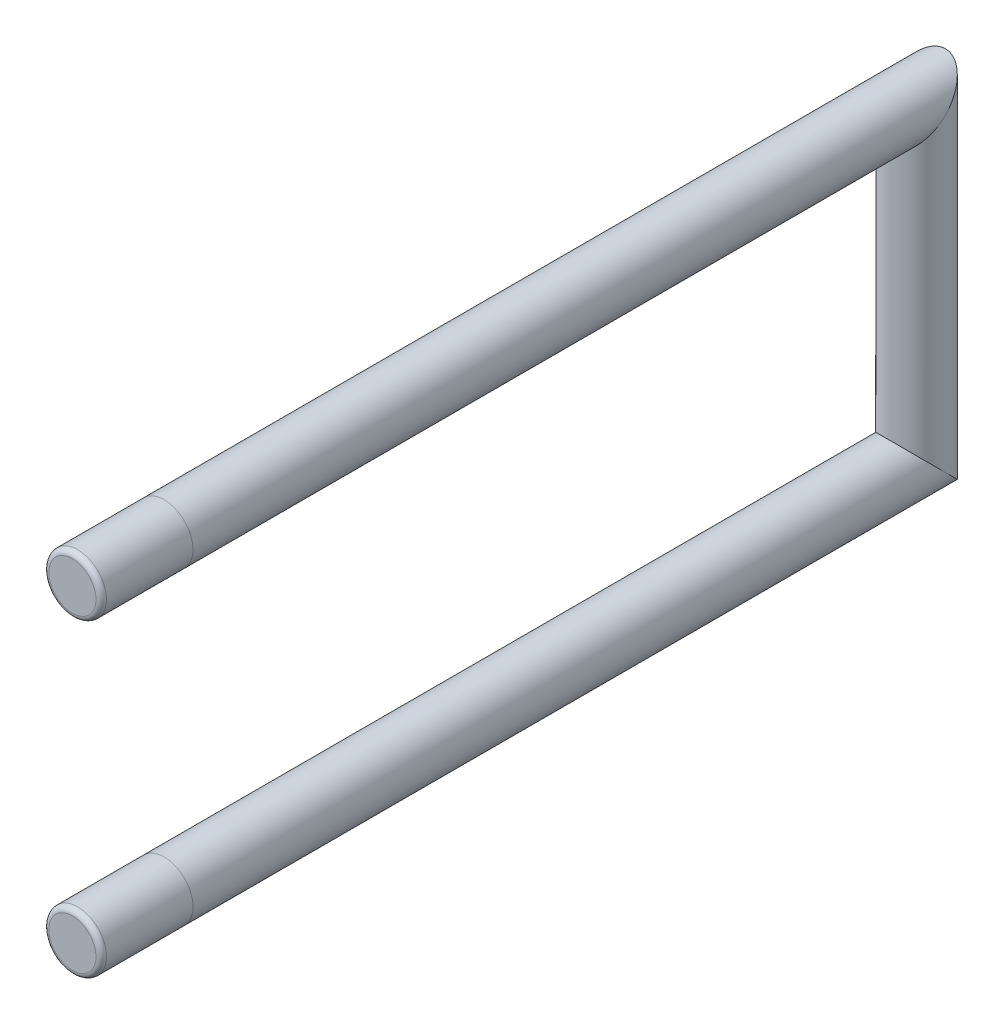
ISO-10303-21;
HEADER;
FILE_DESCRIPTION(('STEP AP214'),'2;1');
FILE_NAME('part.step','',(''),(''),'','','');
FILE_SCHEMA(('AUTOMOTIVE_DESIGN { 1 0 10303 214 1 1 1 1 }'));
ENDSEC;
DATA;
#1=APPLICATION_CONTEXT('core data for automotive mechanical design processes');
#2=APPLICATION_PROTOCOL_DEFINITION('international standard','automotive_design',2000,#1);
#3=PRODUCT_CONTEXT('',#1,'mechanical');
#4=PRODUCT('Part','Part','',(#3));
#5=PRODUCT_RELATED_PRODUCT_CATEGORY('part','',(#4));
#6=PRODUCT_DEFINITION_FORMATION('','',#4);
#7=PRODUCT_DEFINITION_CONTEXT('part definition',#1,'design');
#8=PRODUCT_DEFINITION('design','',#6,#7);
#9=PRODUCT_DEFINITION_SHAPE('','',#8);
#10=(LENGTH_UNIT() NAMED_UNIT(*) SI_UNIT(.MILLI.,.METRE.));
#11=(NAMED_UNIT(*) PLANE_ANGLE_UNIT() SI_UNIT($,.RADIAN.));
#12=(NAMED_UNIT(*) SI_UNIT($,.STERADIAN.) SOLID_ANGLE_UNIT());
#13=UNCERTAINTY_MEASURE_WITH_UNIT(LENGTH_MEASURE(1.E-05),#10,'distance_accuracy_value','');
#14=(GEOMETRIC_REPRESENTATION_CONTEXT(3) GLOBAL_UNCERTAINTY_ASSIGNED_CONTEXT((#13)) GLOBAL_UNIT_ASSIGNED_CONTEXT((#10,
#11,#12)) REPRESENTATION_CONTEXT('',''));
#15=CARTESIAN_POINT('',(0.,0.,0.));
#16=DIRECTION('',(0.,0.,1.));
#17=DIRECTION('',(1.,0.,0.));
#18=AXIS2_PLACEMENT_3D('',#15,#16,#17);
#19=CARTESIAN_POINT('',(0.,118.,0.));
#20=DIRECTION('',(0.,-1.,0.));
#21=DIRECTION('',(0.,0.,-1.));
#22=AXIS2_PLACEMENT_3D('',#19,#20,#21);
#23=CYLINDRICAL_SURFACE('',#22,11.);
#24=CARTESIAN_POINT('',(0.,0.,0.));
#25=DIRECTION('',(0.,0.707106781186547,-0.707106781186547));
#26=DIRECTION('',(0.,-0.707106781186547,-0.707106781186547));
#27=AXIS2_PLACEMENT_3D('',#24,#25,#26);
#28=ELLIPSE('',#27,15.556349186104,11.);
#29=CARTESIAN_POINT('',(-0.104879692967884,-10.9995000000001,-10.9995000000001));
#30=VERTEX_POINT('',#29);
#31=CARTESIAN_POINT('',(0.104879692967884,-10.9995000000001,-10.9995000000001));
#32=VERTEX_POINT('',#31);
#33=EDGE_CURVE('E60',#30,#32,#28,.T.);
#34=ORIENTED_EDGE('',*,*,#33,.T.);
#35=CARTESIAN_POINT('',(0.,-21.9990000000002,0.));
#36=DIRECTION('',(0.,-0.707106781186551,-0.707106781186544));
#37=DIRECTION('',(0.,-0.707106781186544,0.707106781186551));
#38=AXIS2_PLACEMENT_3D('',#35,#36,#37);
#39=ELLIPSE('',#38,15.556349186104,11.);
#40=EDGE_CURVE('E71',#32,#30,#39,.F.);
#41=ORIENTED_EDGE('',*,*,#40,.T.);
#42=EDGE_LOOP('',(#34,#41));
#43=FACE_BOUND('',#42,.T.);
#44=CARTESIAN_POINT('',(0.,118.,0.));
#45=DIRECTION('',(0.,-0.707106781186547,-0.707106781186547));
#46=DIRECTION('',(0.,-0.707106781186547,0.707106781186547));
#47=AXIS2_PLACEMENT_3D('',#44,#45,#46);
#48=ELLIPSE('',#47,15.556349186104,11.);
#49=CARTESIAN_POINT('',(-0.104879692967824,128.9995,-10.9995000000001));
#50=VERTEX_POINT('',#49);
#51=CARTESIAN_POINT('',(0.104879692967745,128.9995,-10.9995000000001));
#52=VERTEX_POINT('',#51);
#53=EDGE_CURVE('E48',#50,#52,#48,.F.);
#54=ORIENTED_EDGE('',*,*,#53,.F.);
#55=CARTESIAN_POINT('',(0.,139.999,0.));
#56=DIRECTION('',(0.,-0.707106781186551,0.707106781186544));
#57=DIRECTION('',(0.,-0.707106781186544,-0.707106781186551));
#58=AXIS2_PLACEMENT_3D('',#55,#56,#57);
#59=ELLIPSE('',#58,15.556349186104,11.);
#60=EDGE_CURVE('E72',#50,#52,#59,.T.);
#61=ORIENTED_EDGE('',*,*,#60,.T.);
#62=EDGE_LOOP('',(#54,#61));
#63=FACE_BOUND('',#62,.T.);
#64=ADVANCED_FACE('F34',(#43,#63),#23,.T.);
#65=CARTESIAN_POINT('',(0.,0.,287.));
#66=DIRECTION('',(0.,0.,-1.));
#67=DIRECTION('',(-1.,0.,0.));
#68=AXIS2_PLACEMENT_3D('',#65,#66,#67);
#69=CYLINDRICAL_SURFACE('',#68,11.);
#70=CARTESIAN_POINT('',(0.,0.,287.));
#71=DIRECTION('',(0.,0.,1.));
#72=DIRECTION('',(1.,0.,0.));
#73=AXIS2_PLACEMENT_3D('',#70,#71,#72);
#74=CIRCLE('',#73,10.9995);
#75=CARTESIAN_POINT('',(10.9995,0.,287.));
#76=VERTEX_POINT('',#75);
#77=EDGE_CURVE('E67',#76,#76,#74,.T.);
#78=ORIENTED_EDGE('',*,*,#77,.F.);
#79=EDGE_LOOP('',(#78));
#80=FACE_BOUND('',#79,.T.);
#81=ORIENTED_EDGE('',*,*,#33,.F.);
#82=CARTESIAN_POINT('',(0.,0.,-21.9990000000004));
#83=DIRECTION('',(0.,-0.707106781186551,-0.707106781186544));
#84=DIRECTION('',(0.,0.707106781186544,-0.707106781186551));
#85=AXIS2_PLACEMENT_3D('',#82,#83,#84);
#86=ELLIPSE('',#85,15.5563491861041,11.);
#87=EDGE_CURVE('E63',#30,#32,#86,.F.);
#88=ORIENTED_EDGE('',*,*,#87,.T.);
#89=EDGE_LOOP('',(#81,#88));
#90=FACE_BOUND('',#89,.T.);
#91=ADVANCED_FACE('F62',(#80,#90),#69,.T.);
#92=CARTESIAN_POINT('',(0.,118.,287.));
#93=DIRECTION('',(0.,0.,-1.));
#94=DIRECTION('',(-1.,0.,0.));
#95=AXIS2_PLACEMENT_3D('',#92,#93,#94);
#96=CYLINDRICAL_SURFACE('',#95,11.);
#97=CARTESIAN_POINT('',(0.,118.,287.));
#98=DIRECTION('',(0.,0.,1.));
#99=DIRECTION('',(1.,0.,0.));
#100=AXIS2_PLACEMENT_3D('',#97,#98,#99);
#101=CIRCLE('',#100,10.9995);
#102=CARTESIAN_POINT('',(10.9995,118.,287.));
#103=VERTEX_POINT('',#102);
#104=EDGE_CURVE('E86',#103,#103,#101,.T.);
#105=ORIENTED_EDGE('',*,*,#104,.F.);
#106=EDGE_LOOP('',(#105));
#107=FACE_BOUND('',#106,.T.);
#108=ORIENTED_EDGE('',*,*,#53,.T.);
#109=CARTESIAN_POINT('',(0.,118.,-21.9990000000004));
#110=DIRECTION('',(0.,-0.707106781186551,0.707106781186544));
#111=DIRECTION('',(0.,-0.707106781186544,-0.707106781186551));
#112=AXIS2_PLACEMENT_3D('',#109,#110,#111);
#113=ELLIPSE('',#112,15.5563491861041,11.);
#114=EDGE_CURVE('E79',#52,#50,#113,.T.);
#115=ORIENTED_EDGE('',*,*,#114,.T.);
#116=EDGE_LOOP('',(#108,#115));
#117=FACE_BOUND('',#116,.T.);
#118=ADVANCED_FACE('F93',(#107,#117),#96,.T.);
#119=CARTESIAN_POINT('',(0.,0.,-21.9990000000004));
#120=DIRECTION('',(0.,-0.707106781186551,-0.707106781186544));
#121=DIRECTION('',(0.,0.707106781186544,-0.707106781186551));
#122=AXIS2_PLACEMENT_3D('',#119,#120,#121);
#123=PLANE('',#122);
#124=ORIENTED_EDGE('',*,*,#40,.F.);
#125=ORIENTED_EDGE('',*,*,#87,.F.);
#126=EDGE_LOOP('',(#124,#125));
#127=FACE_BOUND('',#126,.T.);
#128=ADVANCED_FACE('F70',(#127),#123,.T.);
#129=CARTESIAN_POINT('',(0.,118.,-21.9990000000004));
#130=DIRECTION('',(0.,-0.707106781186551,0.707106781186544));
#131=DIRECTION('',(0.,-0.707106781186544,-0.707106781186551));
#132=AXIS2_PLACEMENT_3D('',#129,#130,#131);
#133=PLANE('',#132);
#134=ORIENTED_EDGE('',*,*,#60,.F.);
#135=ORIENTED_EDGE('',*,*,#114,.F.);
#136=EDGE_LOOP('',(#134,#135));
#137=FACE_BOUND('',#136,.T.);
#138=ADVANCED_FACE('F142',(#137),#133,.F.);
#139=CARTESIAN_POINT('',(0.,118.,322.));
#140=DIRECTION('',(0.,0.,-1.));
#141=DIRECTION('',(-1.,0.,0.));
#142=AXIS2_PLACEMENT_3D('',#139,#140,#141);
#143=CYLINDRICAL_SURFACE('',#142,10.9995);
#144=CARTESIAN_POINT('',(0.,118.,320.));
#145=DIRECTION('',(0.,0.,1.));
#146=DIRECTION('',(1.,0.,0.));
#147=AXIS2_PLACEMENT_3D('',#144,#145,#146);
#148=CIRCLE('',#147,10.9995);
#149=CARTESIAN_POINT('',(10.9995,118.,320.));
#150=VERTEX_POINT('',#149);
#151=EDGE_CURVE('E11',#150,#150,#148,.F.);
#152=ORIENTED_EDGE('',*,*,#151,.T.);
#153=EDGE_LOOP('',(#152));
#154=FACE_BOUND('',#153,.T.);
#155=ORIENTED_EDGE('',*,*,#104,.T.);
#156=EDGE_LOOP('',(#155));
#157=FACE_BOUND('',#156,.T.);
#158=ADVANCED_FACE('F103',(#154,#157),#143,.T.);
#159=CARTESIAN_POINT('',(0.,118.,322.));
#160=DIRECTION('',(0.,0.,1.));
#161=DIRECTION('',(1.,0.,0.));
#162=AXIS2_PLACEMENT_3D('',#159,#160,#161);
#163=PLANE('',#162);
#164=CARTESIAN_POINT('',(0.,118.,322.));
#165=DIRECTION('',(0.,0.,1.));
#166=DIRECTION('',(1.,0.,0.));
#167=AXIS2_PLACEMENT_3D('',#164,#165,#166);
#168=CIRCLE('',#167,8.9995);
#169=CARTESIAN_POINT('',(8.9995,118.,322.));
#170=VERTEX_POINT('',#169);
#171=EDGE_CURVE('E42',#170,#170,#168,.T.);
#172=ORIENTED_EDGE('',*,*,#171,.T.);
#173=EDGE_LOOP('',(#172));
#174=FACE_BOUND('',#173,.T.);
#175=ADVANCED_FACE('F128',(#174),#163,.T.);
#176=CARTESIAN_POINT('',(0.,0.,322.));
#177=DIRECTION('',(0.,0.,-1.));
#178=DIRECTION('',(-1.,0.,0.));
#179=AXIS2_PLACEMENT_3D('',#176,#177,#178);
#180=CYLINDRICAL_SURFACE('',#179,10.9995);
#181=CARTESIAN_POINT('',(0.,0.,320.));
#182=DIRECTION('',(0.,0.,1.));
#183=DIRECTION('',(1.,0.,0.));
#184=AXIS2_PLACEMENT_3D('',#181,#182,#183);
#185=CIRCLE('',#184,10.9995);
#186=CARTESIAN_POINT('',(10.9995,0.,320.));
#187=VERTEX_POINT('',#186);
#188=EDGE_CURVE('E123',#187,#187,#185,.F.);
#189=ORIENTED_EDGE('',*,*,#188,.T.);
#190=EDGE_LOOP('',(#189));
#191=FACE_BOUND('',#190,.T.);
#192=ORIENTED_EDGE('',*,*,#77,.T.);
#193=EDGE_LOOP('',(#192));
#194=FACE_BOUND('',#193,.T.);
#195=ADVANCED_FACE('F157',(#191,#194),#180,.T.);
#196=CARTESIAN_POINT('',(0.,0.,322.));
#197=DIRECTION('',(0.,0.,1.));
#198=DIRECTION('',(1.,0.,0.));
#199=AXIS2_PLACEMENT_3D('',#196,#197,#198);
#200=PLANE('',#199);
#201=CARTESIAN_POINT('',(0.,0.,322.));
#202=DIRECTION('',(0.,0.,1.));
#203=DIRECTION('',(1.,0.,0.));
#204=AXIS2_PLACEMENT_3D('',#201,#202,#203);
#205=CIRCLE('',#204,8.9995);
#206=CARTESIAN_POINT('',(8.9995,0.,322.));
#207=VERTEX_POINT('',#206);
#208=EDGE_CURVE('E81',#207,#207,#205,.T.);
#209=ORIENTED_EDGE('',*,*,#208,.T.);
#210=EDGE_LOOP('',(#209));
#211=FACE_BOUND('',#210,.T.);
#212=ADVANCED_FACE('F136',(#211),#200,.T.);
#213=CARTESIAN_POINT('',(0.,0.,320.));
#214=DIRECTION('',(0.,0.,1.));
#215=DIRECTION('',(1.,0.,0.));
#216=AXIS2_PLACEMENT_3D('',#213,#214,#215);
#217=TOROIDAL_SURFACE('',#216,8.9995,2.);
#218=ORIENTED_EDGE('',*,*,#188,.F.);
#219=EDGE_LOOP('',(#218));
#220=FACE_BOUND('',#219,.T.);
#221=ORIENTED_EDGE('',*,*,#208,.F.);
#222=EDGE_LOOP('',(#221));
#223=FACE_BOUND('',#222,.T.);
#224=ADVANCED_FACE('F131',(#220,#223),#217,.T.);
#225=CARTESIAN_POINT('',(0.,118.,320.));
#226=DIRECTION('',(0.,0.,1.));
#227=DIRECTION('',(1.,0.,0.));
#228=AXIS2_PLACEMENT_3D('',#225,#226,#227);
#229=TOROIDAL_SURFACE('',#228,8.9995,2.);
#230=ORIENTED_EDGE('',*,*,#151,.F.);
#231=EDGE_LOOP('',(#230));
#232=FACE_BOUND('',#231,.T.);
#233=ORIENTED_EDGE('',*,*,#171,.F.);
#234=EDGE_LOOP('',(#233));
#235=FACE_BOUND('',#234,.T.);
#236=ADVANCED_FACE('F36',(#232,#235),#229,.T.);
#237=CLOSED_SHELL('',(#64,#91,#118,#128,#138,#158,#175,#195,#212,#224,#236));
#238=MANIFOLD_SOLID_BREP('B2',#237);
#239=ADVANCED_BREP_SHAPE_REPRESENTATION('',(#18,#238),#14);
#240=SHAPE_DEFINITION_REPRESENTATION(#9,#239);
ENDSEC;
END-ISO-10303-21;
